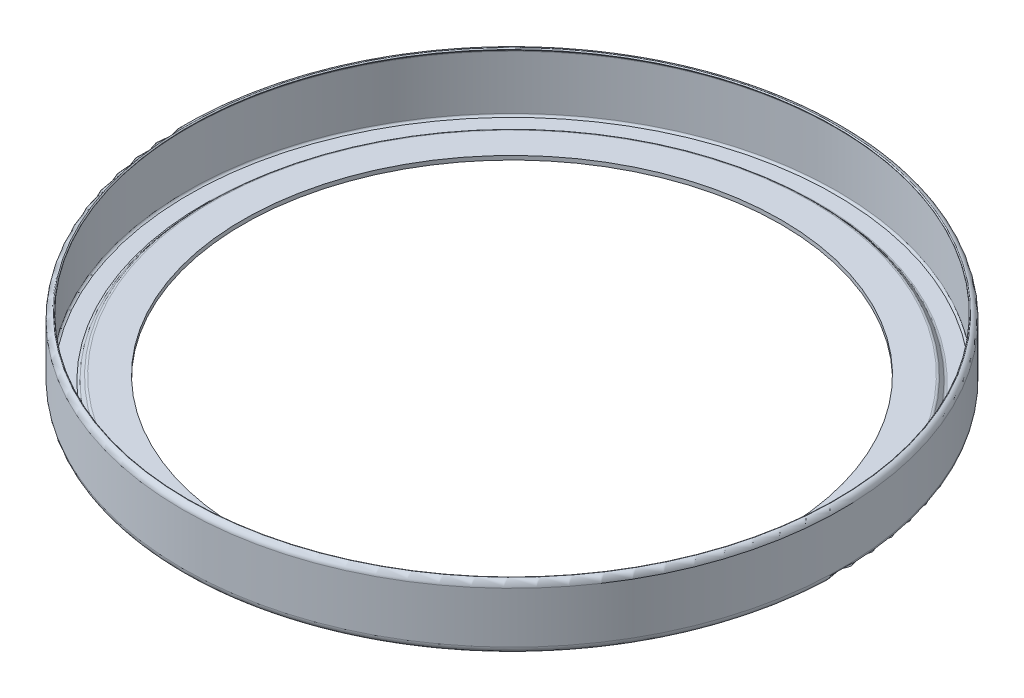
ISO-10303-21;
HEADER;
FILE_DESCRIPTION(('STEP AP214'),'2;1');
FILE_NAME('part.step','',(''),(''),'','','');
FILE_SCHEMA(('AUTOMOTIVE_DESIGN { 1 0 10303 214 1 1 1 1 }'));
ENDSEC;
DATA;
#1=APPLICATION_CONTEXT('core data for automotive mechanical design processes');
#2=APPLICATION_PROTOCOL_DEFINITION('international standard','automotive_design',2000,#1);
#3=PRODUCT_CONTEXT('',#1,'mechanical');
#4=PRODUCT('Part','Part','',(#3));
#5=PRODUCT_RELATED_PRODUCT_CATEGORY('part','',(#4));
#6=PRODUCT_DEFINITION_FORMATION('','',#4);
#7=PRODUCT_DEFINITION_CONTEXT('part definition',#1,'design');
#8=PRODUCT_DEFINITION('design','',#6,#7);
#9=PRODUCT_DEFINITION_SHAPE('','',#8);
#10=(LENGTH_UNIT() NAMED_UNIT(*) SI_UNIT(.MILLI.,.METRE.));
#11=(NAMED_UNIT(*) PLANE_ANGLE_UNIT() SI_UNIT($,.RADIAN.));
#12=(NAMED_UNIT(*) SI_UNIT($,.STERADIAN.) SOLID_ANGLE_UNIT());
#13=UNCERTAINTY_MEASURE_WITH_UNIT(LENGTH_MEASURE(1.E-05),#10,'distance_accuracy_value','');
#14=(GEOMETRIC_REPRESENTATION_CONTEXT(3) GLOBAL_UNCERTAINTY_ASSIGNED_CONTEXT((#13)) GLOBAL_UNIT_ASSIGNED_CONTEXT((#10,
#11,#12)) REPRESENTATION_CONTEXT('',''));
#15=CARTESIAN_POINT('',(0.,0.,0.));
#16=DIRECTION('',(0.,0.,1.));
#17=DIRECTION('',(1.,0.,0.));
#18=AXIS2_PLACEMENT_3D('',#15,#16,#17);
#19=CARTESIAN_POINT('',(0.,-52.0024916943522,0.));
#20=DIRECTION('',(0.,-1.,0.));
#21=DIRECTION('',(0.,0.,-1.));
#22=AXIS2_PLACEMENT_3D('',#19,#20,#21);
#23=CYLINDRICAL_SURFACE('',#22,82.55);
#24=CARTESIAN_POINT('',(0.,-6.17443777315061,0.));
#25=DIRECTION('',(0.,-1.,0.));
#26=DIRECTION('',(0.,0.,-1.));
#27=AXIS2_PLACEMENT_3D('',#24,#25,#26);
#28=CIRCLE('',#27,82.55);
#29=CARTESIAN_POINT('',(0.,-6.17443777315061,-82.55));
#30=VERTEX_POINT('',#29);
#31=EDGE_CURVE('E69',#30,#30,#28,.F.);
#32=ORIENTED_EDGE('',*,*,#31,.T.);
#33=EDGE_LOOP('',(#32));
#34=FACE_BOUND('',#33,.T.);
#35=CARTESIAN_POINT('',(0.,6.58895535211754,0.));
#36=DIRECTION('',(0.,1.,0.));
#37=DIRECTION('',(0.,0.,1.));
#38=AXIS2_PLACEMENT_3D('',#35,#36,#37);
#39=CIRCLE('',#38,82.55);
#40=CARTESIAN_POINT('',(0.,6.58895535211754,82.55));
#41=VERTEX_POINT('',#40);
#42=EDGE_CURVE('E81',#41,#41,#39,.F.);
#43=ORIENTED_EDGE('',*,*,#42,.T.);
#44=EDGE_LOOP('',(#43));
#45=FACE_BOUND('',#44,.T.);
#46=ADVANCED_FACE('F31',(#34,#45),#23,.T.);
#47=CARTESIAN_POINT('',(82.55,-7.92443777315061,0.));
#48=DIRECTION('',(0.,-1.,0.));
#49=DIRECTION('',(0.,0.,-1.));
#50=AXIS2_PLACEMENT_3D('',#47,#48,#49);
#51=PLANE('',#50);
#52=CARTESIAN_POINT('',(0.,-7.92443777315061,0.));
#53=DIRECTION('',(0.,-1.,0.));
#54=DIRECTION('',(0.,0.,-1.));
#55=AXIS2_PLACEMENT_3D('',#52,#53,#54);
#56=CIRCLE('',#55,77.0858030917388);
#57=CARTESIAN_POINT('',(0.,-7.92443777315061,-77.0858030917388));
#58=VERTEX_POINT('',#57);
#59=EDGE_CURVE('E54',#58,#58,#56,.F.);
#60=ORIENTED_EDGE('',*,*,#59,.T.);
#61=EDGE_LOOP('',(#60));
#62=FACE_BOUND('',#61,.T.);
#63=CARTESIAN_POINT('',(0.,-7.92443777315061,0.));
#64=DIRECTION('',(0.,-1.,0.));
#65=DIRECTION('',(0.,0.,-1.));
#66=AXIS2_PLACEMENT_3D('',#63,#64,#65);
#67=CIRCLE('',#66,80.8);
#68=CARTESIAN_POINT('',(0.,-7.92443777315061,-80.8));
#69=VERTEX_POINT('',#68);
#70=EDGE_CURVE('E72',#69,#69,#67,.T.);
#71=ORIENTED_EDGE('',*,*,#70,.T.);
#72=EDGE_LOOP('',(#71));
#73=FACE_BOUND('',#72,.T.);
#74=ADVANCED_FACE('F113',(#62,#73),#51,.T.);
#75=CARTESIAN_POINT('',(0.,-6.52443777315061,0.));
#76=DIRECTION('',(0.,-1.,0.));
#77=DIRECTION('',(0.,0.,-1.));
#78=AXIS2_PLACEMENT_3D('',#75,#76,#77);
#79=CONICAL_SURFACE('',#78,75.5,0.728854726452632);
#80=CARTESIAN_POINT('',(0.,-7.67394960013225,0.));
#81=DIRECTION('',(0.,1.,0.));
#82=DIRECTION('',(0.,0.,1.));
#83=AXIS2_PLACEMENT_3D('',#80,#81,#82);
#84=CIRCLE('',#83,76.5263498455193);
#85=CARTESIAN_POINT('',(0.,-7.67394960013225,76.5263498455193));
#86=VERTEX_POINT('',#85);
#87=EDGE_CURVE('E57',#86,#86,#84,.F.);
#88=ORIENTED_EDGE('',*,*,#87,.T.);
#89=EDGE_LOOP('',(#88));
#90=FACE_BOUND('',#89,.T.);
#91=CARTESIAN_POINT('',(0.,-6.77492594616896,0.));
#92=DIRECTION('',(0.,-1.,0.));
#93=DIRECTION('',(0.,0.,-1.));
#94=AXIS2_PLACEMENT_3D('',#91,#92,#93);
#95=CIRCLE('',#94,75.7236501544807);
#96=CARTESIAN_POINT('',(0.,-6.77492594616896,-75.7236501544807));
#97=VERTEX_POINT('',#96);
#98=EDGE_CURVE('E60',#97,#97,#95,.F.);
#99=ORIENTED_EDGE('',*,*,#98,.T.);
#100=EDGE_LOOP('',(#99));
#101=FACE_BOUND('',#100,.T.);
#102=ADVANCED_FACE('F110',(#90,#101),#79,.F.);
#103=CARTESIAN_POINT('',(75.5,-6.52443777315061,0.));
#104=DIRECTION('',(0.,-1.,0.));
#105=DIRECTION('',(0.,0.,-1.));
#106=AXIS2_PLACEMENT_3D('',#103,#104,#105);
#107=PLANE('',#106);
#108=CARTESIAN_POINT('',(0.,-6.52443777315061,0.));
#109=DIRECTION('',(0.,-1.,0.));
#110=DIRECTION('',(0.,0.,-1.));
#111=AXIS2_PLACEMENT_3D('',#108,#109,#110);
#112=CIRCLE('',#111,75.1641969082612);
#113=CARTESIAN_POINT('',(0.,-6.52443777315061,-75.1641969082612));
#114=VERTEX_POINT('',#113);
#115=EDGE_CURVE('E38',#114,#114,#112,.T.);
#116=ORIENTED_EDGE('',*,*,#115,.T.);
#117=EDGE_LOOP('',(#116));
#118=FACE_BOUND('',#117,.T.);
#119=CARTESIAN_POINT('',(0.,-6.52443777315061,0.));
#120=DIRECTION('',(0.,-1.,0.));
#121=DIRECTION('',(0.,0.,-1.));
#122=AXIS2_PLACEMENT_3D('',#119,#120,#121);
#123=CIRCLE('',#122,67.4);
#124=CARTESIAN_POINT('',(0.,-6.52443777315061,-67.4));
#125=VERTEX_POINT('',#124);
#126=EDGE_CURVE('E91',#125,#125,#123,.T.);
#127=ORIENTED_EDGE('',*,*,#126,.F.);
#128=EDGE_LOOP('',(#127));
#129=FACE_BOUND('',#128,.T.);
#130=ADVANCED_FACE('F101',(#118,#129),#107,.T.);
#131=CARTESIAN_POINT('',(0.,-52.0024916943522,0.));
#132=DIRECTION('',(0.,-1.,0.));
#133=DIRECTION('',(0.,0.,-1.));
#134=AXIS2_PLACEMENT_3D('',#131,#132,#133);
#135=CYLINDRICAL_SURFACE('',#134,67.4);
#136=ORIENTED_EDGE('',*,*,#126,.T.);
#137=EDGE_LOOP('',(#136));
#138=FACE_BOUND('',#137,.T.);
#139=CARTESIAN_POINT('',(0.,-5.52443777315061,0.));
#140=DIRECTION('',(0.,-1.,0.));
#141=DIRECTION('',(0.,0.,-1.));
#142=AXIS2_PLACEMENT_3D('',#139,#140,#141);
#143=CIRCLE('',#142,67.4);
#144=CARTESIAN_POINT('',(0.,-5.52443777315061,-67.4));
#145=VERTEX_POINT('',#144);
#146=EDGE_CURVE('E88',#145,#145,#143,.T.);
#147=ORIENTED_EDGE('',*,*,#146,.F.);
#148=EDGE_LOOP('',(#147));
#149=FACE_BOUND('',#148,.T.);
#150=ADVANCED_FACE('F99',(#138,#149),#135,.F.);
#151=CARTESIAN_POINT('',(67.4,-5.52443777315061,0.));
#152=DIRECTION('',(0.,1.,0.));
#153=DIRECTION('',(0.,0.,1.));
#154=AXIS2_PLACEMENT_3D('',#151,#152,#153);
#155=PLANE('',#154);
#156=CARTESIAN_POINT('',(0.,-5.52443777315061,0.));
#157=DIRECTION('',(0.,1.,0.));
#158=DIRECTION('',(0.,0.,1.));
#159=AXIS2_PLACEMENT_3D('',#156,#157,#158);
#160=CIRCLE('',#159,75.1641969082612);
#161=CARTESIAN_POINT('',(0.,-5.52443777315061,75.1641969082612));
#162=VERTEX_POINT('',#161);
#163=EDGE_CURVE('E10',#162,#162,#160,.T.);
#164=ORIENTED_EDGE('',*,*,#163,.T.);
#165=EDGE_LOOP('',(#164));
#166=FACE_BOUND('',#165,.T.);
#167=ORIENTED_EDGE('',*,*,#146,.T.);
#168=EDGE_LOOP('',(#167));
#169=FACE_BOUND('',#168,.T.);
#170=ADVANCED_FACE('F97',(#166,#169),#155,.T.);
#171=CARTESIAN_POINT('',(0.,-6.92443777315061,0.));
#172=DIRECTION('',(0.,-1.,0.));
#173=DIRECTION('',(0.,0.,-1.));
#174=AXIS2_PLACEMENT_3D('',#171,#172,#173);
#175=CONICAL_SURFACE('',#174,76.75,0.728854726452632);
#176=CARTESIAN_POINT('',(0.,-6.67394960013226,0.));
#177=DIRECTION('',(0.,-1.,0.));
#178=DIRECTION('',(0.,0.,-1.));
#179=AXIS2_PLACEMENT_3D('',#176,#177,#178);
#180=CIRCLE('',#179,76.5263498455193);
#181=CARTESIAN_POINT('',(0.,-6.67394960013226,-76.5263498455193));
#182=VERTEX_POINT('',#181);
#183=EDGE_CURVE('E42',#182,#182,#180,.F.);
#184=ORIENTED_EDGE('',*,*,#183,.T.);
#185=EDGE_LOOP('',(#184));
#186=FACE_BOUND('',#185,.T.);
#187=CARTESIAN_POINT('',(0.,-5.77492594616896,0.));
#188=DIRECTION('',(0.,1.,0.));
#189=DIRECTION('',(0.,0.,1.));
#190=AXIS2_PLACEMENT_3D('',#187,#188,#189);
#191=CIRCLE('',#190,75.7236501544807);
#192=CARTESIAN_POINT('',(0.,-5.77492594616896,75.7236501544807));
#193=VERTEX_POINT('',#192);
#194=EDGE_CURVE('E46',#193,#193,#191,.F.);
#195=ORIENTED_EDGE('',*,*,#194,.T.);
#196=EDGE_LOOP('',(#195));
#197=FACE_BOUND('',#196,.T.);
#198=ADVANCED_FACE('F108',(#186,#197),#175,.T.);
#199=CARTESIAN_POINT('',(76.75,-6.92443777315061,0.));
#200=DIRECTION('',(0.,1.,0.));
#201=DIRECTION('',(0.,0.,1.));
#202=AXIS2_PLACEMENT_3D('',#199,#200,#201);
#203=PLANE('',#202);
#204=CARTESIAN_POINT('',(0.,-6.92443777315061,0.));
#205=DIRECTION('',(0.,1.,0.));
#206=DIRECTION('',(0.,0.,1.));
#207=AXIS2_PLACEMENT_3D('',#204,#205,#206);
#208=CIRCLE('',#207,77.0858030917388);
#209=CARTESIAN_POINT('',(0.,-6.92443777315061,77.0858030917388));
#210=VERTEX_POINT('',#209);
#211=EDGE_CURVE('E51',#210,#210,#208,.F.);
#212=ORIENTED_EDGE('',*,*,#211,.T.);
#213=EDGE_LOOP('',(#212));
#214=FACE_BOUND('',#213,.T.);
#215=CARTESIAN_POINT('',(0.,-6.92443777315061,0.));
#216=DIRECTION('',(0.,1.,0.));
#217=DIRECTION('',(0.,0.,1.));
#218=AXIS2_PLACEMENT_3D('',#215,#216,#217);
#219=CIRCLE('',#218,81.05);
#220=CARTESIAN_POINT('',(0.,-6.92443777315061,81.05));
#221=VERTEX_POINT('',#220);
#222=EDGE_CURVE('E63',#221,#221,#219,.T.);
#223=ORIENTED_EDGE('',*,*,#222,.T.);
#224=EDGE_LOOP('',(#223));
#225=FACE_BOUND('',#224,.T.);
#226=ADVANCED_FACE('F194',(#214,#225),#203,.T.);
#227=CARTESIAN_POINT('',(0.,-52.0024916943522,0.));
#228=DIRECTION('',(0.,-1.,0.));
#229=DIRECTION('',(0.,0.,-1.));
#230=AXIS2_PLACEMENT_3D('',#227,#228,#229);
#231=CYLINDRICAL_SURFACE('',#230,81.55);
#232=CARTESIAN_POINT('',(0.,-6.42443777315061,0.));
#233=DIRECTION('',(0.,1.,0.));
#234=DIRECTION('',(0.,0.,1.));
#235=AXIS2_PLACEMENT_3D('',#232,#233,#234);
#236=CIRCLE('',#235,81.55);
#237=CARTESIAN_POINT('',(0.,-6.42443777315061,81.55));
#238=VERTEX_POINT('',#237);
#239=EDGE_CURVE('E66',#238,#238,#236,.F.);
#240=ORIENTED_EDGE('',*,*,#239,.T.);
#241=EDGE_LOOP('',(#240));
#242=FACE_BOUND('',#241,.T.);
#243=CARTESIAN_POINT('',(0.,7.10272061210929,0.));
#244=DIRECTION('',(0.,-1.,0.));
#245=DIRECTION('',(0.,0.,-1.));
#246=AXIS2_PLACEMENT_3D('',#243,#244,#245);
#247=CIRCLE('',#246,81.55);
#248=CARTESIAN_POINT('',(0.,7.10272061210929,-81.55));
#249=VERTEX_POINT('',#248);
#250=EDGE_CURVE('E75',#249,#249,#247,.F.);
#251=ORIENTED_EDGE('',*,*,#250,.T.);
#252=EDGE_LOOP('',(#251));
#253=FACE_BOUND('',#252,.T.);
#254=ADVANCED_FACE('F132',(#242,#253),#231,.F.);
#255=CARTESIAN_POINT('',(0.,7.82556222684939,0.));
#256=DIRECTION('',(0.,1.,0.));
#257=DIRECTION('',(0.,0.,1.));
#258=AXIS2_PLACEMENT_3D('',#255,#256,#257);
#259=TOROIDAL_SURFACE('',#258,81.25,0.25);
#260=CARTESIAN_POINT('',(0.,8.07556222684939,0.));
#261=DIRECTION('',(0.,1.,0.));
#262=DIRECTION('',(0.,0.,1.));
#263=AXIS2_PLACEMENT_3D('',#260,#261,#262);
#264=CIRCLE('',#263,81.25);
#265=CARTESIAN_POINT('',(0.,8.07556222684939,81.25));
#266=VERTEX_POINT('',#265);
#267=EDGE_CURVE('E84',#266,#266,#264,.F.);
#268=ORIENTED_EDGE('',*,*,#267,.F.);
#269=EDGE_LOOP('',(#268));
#270=FACE_BOUND('',#269,.T.);
#271=CARTESIAN_POINT('',(0.,7.82556222684939,0.));
#272=DIRECTION('',(0.,1.,0.));
#273=DIRECTION('',(0.,0.,1.));
#274=AXIS2_PLACEMENT_3D('',#271,#272,#273);
#275=CIRCLE('',#274,81.);
#276=CARTESIAN_POINT('',(0.,7.82556222684939,81.));
#277=VERTEX_POINT('',#276);
#278=EDGE_CURVE('E85',#277,#277,#275,.T.);
#279=ORIENTED_EDGE('',*,*,#278,.F.);
#280=EDGE_LOOP('',(#279));
#281=FACE_BOUND('',#280,.T.);
#282=ADVANCED_FACE('F128',(#270,#281),#259,.T.);
#283=CARTESIAN_POINT('',(0.,7.82556222684939,0.));
#284=DIRECTION('',(0.,-1.,0.));
#285=DIRECTION('',(0.,0.,-1.));
#286=AXIS2_PLACEMENT_3D('',#283,#284,#285);
#287=TOROIDAL_SURFACE('',#286,81.25,0.25);
#288=CARTESIAN_POINT('',(0.,7.58461502193674,0.));
#289=DIRECTION('',(0.,1.,0.));
#290=DIRECTION('',(0.,0.,1.));
#291=AXIS2_PLACEMENT_3D('',#288,#289,#290);
#292=CIRCLE('',#291,81.1833333333335);
#293=CARTESIAN_POINT('',(0.,7.58461502193674,81.1833333333335));
#294=VERTEX_POINT('',#293);
#295=EDGE_CURVE('E78',#294,#294,#292,.F.);
#296=ORIENTED_EDGE('',*,*,#295,.T.);
#297=EDGE_LOOP('',(#296));
#298=FACE_BOUND('',#297,.T.);
#299=ORIENTED_EDGE('',*,*,#278,.T.);
#300=EDGE_LOOP('',(#299));
#301=FACE_BOUND('',#300,.T.);
#302=ADVANCED_FACE('F124',(#298,#301),#287,.T.);
#303=CARTESIAN_POINT('',(0.,6.58895535211754,0.));
#304=DIRECTION('',(0.,1.,0.));
#305=DIRECTION('',(0.,0.,1.));
#306=AXIS2_PLACEMENT_3D('',#303,#304,#305);
#307=TOROIDAL_SURFACE('',#306,81.05,1.5);
#308=ORIENTED_EDGE('',*,*,#267,.T.);
#309=EDGE_LOOP('',(#308));
#310=FACE_BOUND('',#309,.T.);
#311=ORIENTED_EDGE('',*,*,#42,.F.);
#312=EDGE_LOOP('',(#311));
#313=FACE_BOUND('',#312,.T.);
#314=ADVANCED_FACE('F127',(#310,#313),#307,.T.);
#315=CARTESIAN_POINT('',(0.,7.10272061210928,0.));
#316=DIRECTION('',(0.,-1.,0.));
#317=DIRECTION('',(0.,0.,-1.));
#318=AXIS2_PLACEMENT_3D('',#315,#316,#317);
#319=TOROIDAL_SURFACE('',#318,81.05,0.5);
#320=ORIENTED_EDGE('',*,*,#250,.F.);
#321=EDGE_LOOP('',(#320));
#322=FACE_BOUND('',#321,.T.);
#323=ORIENTED_EDGE('',*,*,#295,.F.);
#324=EDGE_LOOP('',(#323));
#325=FACE_BOUND('',#324,.T.);
#326=ADVANCED_FACE('F136',(#322,#325),#319,.F.);
#327=CARTESIAN_POINT('',(0.,-6.17443777315061,0.));
#328=DIRECTION('',(0.,-1.,0.));
#329=DIRECTION('',(0.,0.,-1.));
#330=AXIS2_PLACEMENT_3D('',#327,#328,#329);
#331=TOROIDAL_SURFACE('',#330,80.8,1.75);
#332=ORIENTED_EDGE('',*,*,#31,.F.);
#333=EDGE_LOOP('',(#332));
#334=FACE_BOUND('',#333,.T.);
#335=ORIENTED_EDGE('',*,*,#70,.F.);
#336=EDGE_LOOP('',(#335));
#337=FACE_BOUND('',#336,.T.);
#338=ADVANCED_FACE('F140',(#334,#337),#331,.T.);
#339=CARTESIAN_POINT('',(0.,-6.42443777315061,0.));
#340=DIRECTION('',(0.,1.,0.));
#341=DIRECTION('',(0.,0.,1.));
#342=AXIS2_PLACEMENT_3D('',#339,#340,#341);
#343=TOROIDAL_SURFACE('',#342,81.05,0.5);
#344=ORIENTED_EDGE('',*,*,#222,.F.);
#345=EDGE_LOOP('',(#344));
#346=FACE_BOUND('',#345,.T.);
#347=ORIENTED_EDGE('',*,*,#239,.F.);
#348=EDGE_LOOP('',(#347));
#349=FACE_BOUND('',#348,.T.);
#350=ADVANCED_FACE('F144',(#346,#349),#343,.F.);
#351=CARTESIAN_POINT('',(0.,-7.17443777315061,0.));
#352=DIRECTION('',(0.,-1.,0.));
#353=DIRECTION('',(0.,0.,-1.));
#354=AXIS2_PLACEMENT_3D('',#351,#352,#353);
#355=TOROIDAL_SURFACE('',#354,77.0858030917388,0.75);
#356=ORIENTED_EDGE('',*,*,#59,.F.);
#357=EDGE_LOOP('',(#356));
#358=FACE_BOUND('',#357,.T.);
#359=ORIENTED_EDGE('',*,*,#87,.F.);
#360=EDGE_LOOP('',(#359));
#361=FACE_BOUND('',#360,.T.);
#362=ADVANCED_FACE('F148',(#358,#361),#355,.T.);
#363=CARTESIAN_POINT('',(0.,-6.17443777315061,0.));
#364=DIRECTION('',(0.,1.,0.));
#365=DIRECTION('',(0.,0.,1.));
#366=AXIS2_PLACEMENT_3D('',#363,#364,#365);
#367=TOROIDAL_SURFACE('',#366,77.0858030917388,0.75);
#368=ORIENTED_EDGE('',*,*,#183,.F.);
#369=EDGE_LOOP('',(#368));
#370=FACE_BOUND('',#369,.T.);
#371=ORIENTED_EDGE('',*,*,#211,.F.);
#372=EDGE_LOOP('',(#371));
#373=FACE_BOUND('',#372,.T.);
#374=ADVANCED_FACE('F152',(#370,#373),#367,.F.);
#375=CARTESIAN_POINT('',(0.,-7.27443777315061,0.));
#376=DIRECTION('',(0.,-1.,0.));
#377=DIRECTION('',(0.,0.,-1.));
#378=AXIS2_PLACEMENT_3D('',#375,#376,#377);
#379=TOROIDAL_SURFACE('',#378,75.1641969082612,0.75);
#380=ORIENTED_EDGE('',*,*,#98,.F.);
#381=EDGE_LOOP('',(#380));
#382=FACE_BOUND('',#381,.T.);
#383=ORIENTED_EDGE('',*,*,#115,.F.);
#384=EDGE_LOOP('',(#383));
#385=FACE_BOUND('',#384,.T.);
#386=ADVANCED_FACE('F155',(#382,#385),#379,.F.);
#387=CARTESIAN_POINT('',(0.,-6.27443777315061,0.));
#388=DIRECTION('',(0.,1.,0.));
#389=DIRECTION('',(0.,0.,1.));
#390=AXIS2_PLACEMENT_3D('',#387,#388,#389);
#391=TOROIDAL_SURFACE('',#390,75.1641969082612,0.75);
#392=ORIENTED_EDGE('',*,*,#163,.F.);
#393=EDGE_LOOP('',(#392));
#394=FACE_BOUND('',#393,.T.);
#395=ORIENTED_EDGE('',*,*,#194,.F.);
#396=EDGE_LOOP('',(#395));
#397=FACE_BOUND('',#396,.T.);
#398=ADVANCED_FACE('F33',(#394,#397),#391,.T.);
#399=CLOSED_SHELL('',(#46,#74,#102,#130,#150,#170,#198,#226,#254,#282,#302,#314,#326,#338,#350,
#362,#374,#386,#398));
#400=MANIFOLD_SOLID_BREP('B2',#399);
#401=ADVANCED_BREP_SHAPE_REPRESENTATION('',(#18,#400),#14);
#402=SHAPE_DEFINITION_REPRESENTATION(#9,#401);
ENDSEC;
END-ISO-10303-21;
